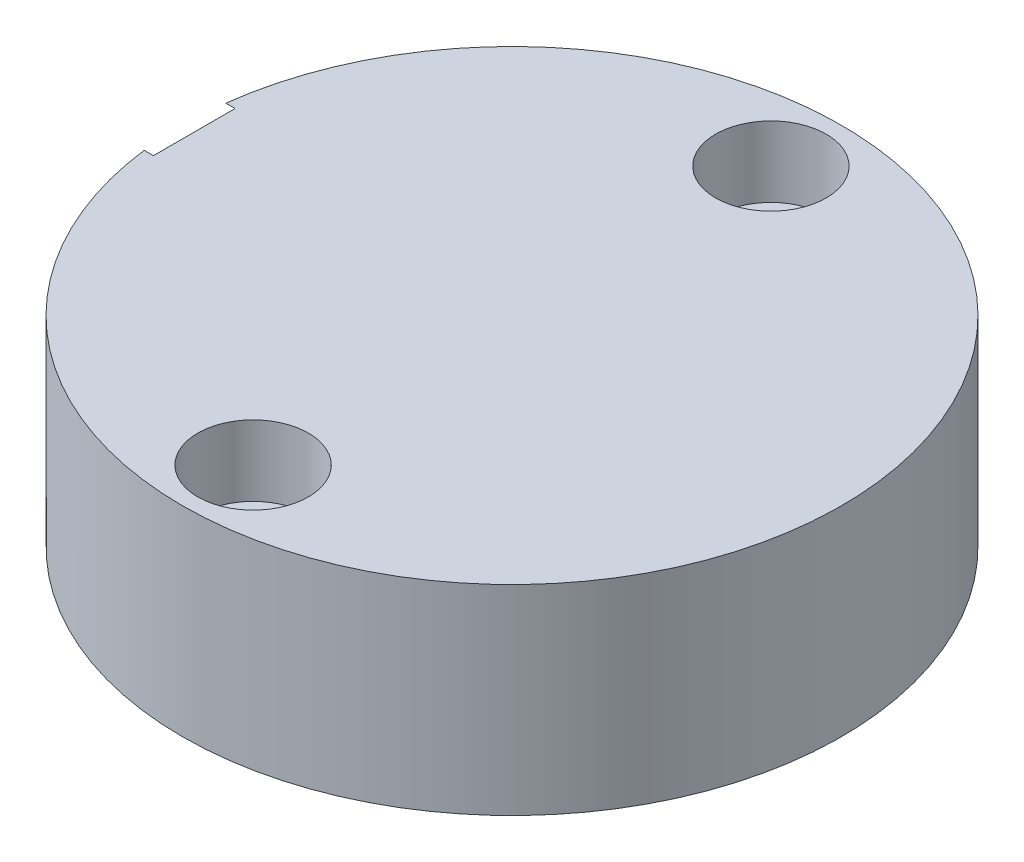
ISO-10303-21;
HEADER;
FILE_DESCRIPTION(('STEP AP214'),'2;1');
FILE_NAME('part.step','',(''),(''),'','','');
FILE_SCHEMA(('AUTOMOTIVE_DESIGN { 1 0 10303 214 1 1 1 1 }'));
ENDSEC;
DATA;
#1=APPLICATION_CONTEXT('core data for automotive mechanical design processes');
#2=APPLICATION_PROTOCOL_DEFINITION('international standard','automotive_design',2000,#1);
#3=PRODUCT_CONTEXT('',#1,'mechanical');
#4=PRODUCT('Part','Part','',(#3));
#5=PRODUCT_RELATED_PRODUCT_CATEGORY('part','',(#4));
#6=PRODUCT_DEFINITION_FORMATION('','',#4);
#7=PRODUCT_DEFINITION_CONTEXT('part definition',#1,'design');
#8=PRODUCT_DEFINITION('design','',#6,#7);
#9=PRODUCT_DEFINITION_SHAPE('','',#8);
#10=(LENGTH_UNIT() NAMED_UNIT(*) SI_UNIT(.MILLI.,.METRE.));
#11=(NAMED_UNIT(*) PLANE_ANGLE_UNIT() SI_UNIT($,.RADIAN.));
#12=(NAMED_UNIT(*) SI_UNIT($,.STERADIAN.) SOLID_ANGLE_UNIT());
#13=UNCERTAINTY_MEASURE_WITH_UNIT(LENGTH_MEASURE(1.E-05),#10,'distance_accuracy_value','');
#14=(GEOMETRIC_REPRESENTATION_CONTEXT(3) GLOBAL_UNCERTAINTY_ASSIGNED_CONTEXT((#13)) GLOBAL_UNIT_ASSIGNED_CONTEXT((#10,
#11,#12)) REPRESENTATION_CONTEXT('',''));
#15=CARTESIAN_POINT('',(0.,0.,0.));
#16=DIRECTION('',(0.,0.,1.));
#17=DIRECTION('',(1.,0.,0.));
#18=AXIS2_PLACEMENT_3D('',#15,#16,#17);
#19=CARTESIAN_POINT('',(0.,0.,0.));
#20=DIRECTION('',(0.,1.,0.));
#21=DIRECTION('',(0.,0.,1.));
#22=AXIS2_PLACEMENT_3D('',#19,#20,#21);
#23=CYLINDRICAL_SURFACE('',#22,14.224);
#24=CARTESIAN_POINT('',(-14.1144017031364,8.636,-1.76233951396999));
#25=CARTESIAN_POINT('',(-14.1018189708603,8.5860400774121,-1.86316944306617));
#26=CARTESIAN_POINT('',(-14.0884029510449,8.53182037336474,-1.96177374774942));
#27=CARTESIAN_POINT('',(-14.060309209815,8.41531440898184,-2.15389238319063));
#28=CARTESIAN_POINT('',(-14.0456316331366,8.35302907358731,-2.24740729584016));
#29=CARTESIAN_POINT('',(-14.0153964032384,8.22074490813978,-2.42885291939024));
#30=CARTESIAN_POINT('',(-13.9998376006231,8.15073588572585,-2.51677600419321));
#31=CARTESIAN_POINT('',(-13.9682944020645,8.00356223569752,-2.68632848078117));
#32=CARTESIAN_POINT('',(-13.9523100128641,7.92639772140656,-2.76795797220202));
#33=CARTESIAN_POINT('',(-13.9203573702186,7.76540029526525,-2.92441560607991));
#34=CARTESIAN_POINT('',(-13.9043891243674,7.68156506176776,-2.99924136100932));
#35=CARTESIAN_POINT('',(-13.8729273525824,7.50779999847033,-3.1415560905345));
#36=CARTESIAN_POINT('',(-13.8574338186305,7.41787027169462,-3.20904518910241));
#37=CARTESIAN_POINT('',(-13.8273998231862,7.23269940985755,-3.33608202397885));
#38=CARTESIAN_POINT('',(-13.8128574379487,7.1374697652673,-3.39564605863353));
#39=CARTESIAN_POINT('',(-13.7851236400461,6.94219371995553,-3.50653797394215));
#40=CARTESIAN_POINT('',(-13.7719315387029,6.84214981329113,-3.55787006074027));
#41=CARTESIAN_POINT('',(-13.7515217306795,6.67297933704027,-3.63577308768279));
#42=CARTESIAN_POINT('',(-13.7438077843705,6.60502971023918,-3.66479473624717));
#43=CARTESIAN_POINT('',(-13.7292386448564,6.46761208866137,-3.71899995238225));
#44=CARTESIAN_POINT('',(-13.7223825366595,6.39814580613028,-3.74418761569942));
#45=CARTESIAN_POINT('',(-13.716,6.3279809944466,-3.7674288314446));
#46=B_SPLINE_CURVE_WITH_KNOTS('',3,(#24,#25,#26,#27,#28,#29,#30,#31,#32,#33,#34,#35,#36,#37,#38,
#39,#40,#41,#42,#43,#44,#45),.UNSPECIFIED.,.F.,.F.,(4,2,2,2,2,2,2,2,2,2,4),(0.,
0.339571560025639,0.679104213490783,1.01909040632158,1.35907121561906,1.6991708722571,
2.0392647811214,2.37864808472907,2.71785742283711,2.94061439026513,3.1631316964547),.UNSPECIFIED.);
#47=CARTESIAN_POINT('',(-14.1144017031364,8.636,-1.76233951396999));
#48=VERTEX_POINT('',#47);
#49=CARTESIAN_POINT('',(-13.716,6.3279809944466,-3.7674288314446));
#50=VERTEX_POINT('',#49);
#51=EDGE_CURVE('E183',#48,#50,#46,.T.);
#52=ORIENTED_EDGE('',*,*,#51,.F.);
#53=CARTESIAN_POINT('',(0.,8.636,0.));
#54=DIRECTION('',(0.,1.,0.));
#55=DIRECTION('',(0.,0.,1.));
#56=AXIS2_PLACEMENT_3D('',#53,#54,#55);
#57=CIRCLE('',#56,14.224);
#58=CARTESIAN_POINT('',(-14.1144017031364,8.636,1.76233951396999));
#59=VERTEX_POINT('',#58);
#60=EDGE_CURVE('E152',#59,#48,#57,.T.);
#61=ORIENTED_EDGE('',*,*,#60,.F.);
#62=CARTESIAN_POINT('',(-13.716,6.32798099444662,3.7674288314446));
#63=CARTESIAN_POINT('',(-13.7256752274223,6.43441671403951,3.73218226606413));
#64=CARTESIAN_POINT('',(-13.7364511952819,6.5392480193785,3.69244070180806));
#65=CARTESIAN_POINT('',(-13.7598334716294,6.74499152616562,3.60434170694817));
#66=CARTESIAN_POINT('',(-13.7724394284483,6.84590447589213,3.55598593133243));
#67=CARTESIAN_POINT('',(-13.7991212477723,7.04319198204466,3.45099243760769));
#68=CARTESIAN_POINT('',(-13.8131978464105,7.1395642302546,3.39435056614256));
#69=CARTESIAN_POINT('',(-13.8423953365519,7.32706281981836,3.27324792969377));
#70=CARTESIAN_POINT('',(-13.8575162318728,7.41818914199239,3.2087871361258));
#71=CARTESIAN_POINT('',(-13.9037966552396,7.68277980250731,3.00434946030897));
#72=CARTESIAN_POINT('',(-13.9359009480219,7.8476460188197,2.85321568473428));
#73=CARTESIAN_POINT('',(-13.9989711835599,8.14950079732574,2.525596782463));
#74=CARTESIAN_POINT('',(-14.0299392423452,8.28654358683355,2.34916213506834));
#75=CARTESIAN_POINT('',(-14.0685657406809,8.44971584425602,2.09807351538581));
#76=CARTESIAN_POINT('',(-14.0782051283558,8.489695649873,2.03245392920464));
#77=CARTESIAN_POINT('',(-14.0968231765953,8.56576823735887,1.89901959457042));
#78=CARTESIAN_POINT('',(-14.1058026527453,8.6018658437257,1.83120771016513));
#79=CARTESIAN_POINT('',(-14.1144017031364,8.636,1.76233951396999));
#80=B_SPLINE_CURVE_WITH_KNOTS('',3,(#62,#63,#64,#65,#66,#67,#68,#69,#70,#71,#72,#73,#74,#75,#76,
#77,#78,#79),.UNSPECIFIED.,.F.,.F.,(4,2,2,2,2,2,2,2,4),(0.,0.337481169142765,0.674897570182395,
1.01248368238958,1.35007102877738,2.02460201647477,2.69780546224259,2.93003018694968,
3.16196290219643),.UNSPECIFIED.);
#81=CARTESIAN_POINT('',(-13.716,6.32798099444662,3.7674288314446));
#82=VERTEX_POINT('',#81);
#83=EDGE_CURVE('E57',#82,#59,#80,.T.);
#84=ORIENTED_EDGE('',*,*,#83,.F.);
#85=DIRECTION('',(0.,1.,0.));
#86=VECTOR('',#85,1.);
#87=CARTESIAN_POINT('',(-13.716,0.,3.7674288314446));
#88=LINE('',#87,#86);
#89=CARTESIAN_POINT('',(-13.716,3.83201900555338,3.7674288314446));
#90=VERTEX_POINT('',#89);
#91=EDGE_CURVE('E164',#90,#82,#88,.T.);
#92=ORIENTED_EDGE('',*,*,#91,.F.);
#93=CARTESIAN_POINT('',(-13.716,3.8320190055534,-3.7674288314446));
#94=CARTESIAN_POINT('',(-13.7256832030554,3.72549547487357,-3.73215300898994));
#95=CARTESIAN_POINT('',(-13.7364689511062,3.62057917763459,-3.69237510692438));
#96=CARTESIAN_POINT('',(-13.7598730650016,3.41467658831599,-3.60419119044807));
#97=CARTESIAN_POINT('',(-13.7724910095912,3.3136893996123,-3.55578715876054));
#98=CARTESIAN_POINT('',(-13.7991770735619,3.11642010455883,-3.45076856800852));
#99=CARTESIAN_POINT('',(-13.8132435746677,3.0201329211109,-3.39416314307337));
#100=CARTESIAN_POINT('',(-13.8424190011879,2.83279443524339,-3.27314752117977));
#101=CARTESIAN_POINT('',(-13.8575279696299,2.74174334922734,-3.20873700198464));
#102=CARTESIAN_POINT('',(-13.9037657698442,2.4773975772599,-3.00448246486439));
#103=CARTESIAN_POINT('',(-13.9358393240575,2.31267237301909,-2.85348831252477));
#104=CARTESIAN_POINT('',(-13.9989028009506,2.01080298829319,-2.52599924707586));
#105=CARTESIAN_POINT('',(-14.0298926315931,1.87366114569923,-2.3495021745848));
#106=CARTESIAN_POINT('',(-14.0877428513713,1.62926520659395,-1.97337670408356));
#107=CARTESIAN_POINT('',(-14.1145538216584,1.52235814638346,-1.77351423734908));
#108=CARTESIAN_POINT('',(-14.1605904232901,1.34387846931438,-1.35776696177541));
#109=CARTESIAN_POINT('',(-14.1798170716613,1.27230111456323,-1.14188430579399));
#110=CARTESIAN_POINT('',(-14.208102650291,1.16829544419417,-0.706019846943991));
#111=CARTESIAN_POINT('',(-14.2174060804188,1.13492416082455,-0.486279224026567));
#112=CARTESIAN_POINT('',(-14.2256485600171,1.10531829732902,-0.0441420578764475));
#113=CARTESIAN_POINT('',(-14.2245897983837,1.10907587415198,0.178253914530367));
#114=CARTESIAN_POINT('',(-14.2124057676836,1.15295471256416,0.612960969777735));
#115=CARTESIAN_POINT('',(-14.2015564223421,1.19207929289632,0.82538155554918));
#116=CARTESIAN_POINT('',(-14.1713318873773,1.30397960109528,1.24051122348173));
#117=CARTESIAN_POINT('',(-14.1519563507052,1.37675669875519,1.44321990995869));
#118=CARTESIAN_POINT('',(-14.106443156029,1.55466493345507,1.83573826506913));
#119=CARTESIAN_POINT('',(-14.0802343895498,1.66013864329423,2.02538406035225));
#120=CARTESIAN_POINT('',(-14.0238597684823,1.90021661958655,2.38467213064943));
#121=CARTESIAN_POINT('',(-13.9936921490099,2.03483389593779,2.55430541951769));
#122=CARTESIAN_POINT('',(-13.9314568097912,2.33472831851489,2.87476374704252));
#123=CARTESIAN_POINT('',(-13.8993593677901,2.5008933223189,3.02475174150323));
#124=CARTESIAN_POINT('',(-13.8378375095089,2.85626447377719,3.29479043090516));
#125=CARTESIAN_POINT('',(-13.8084099104598,3.04544253989866,3.41487707798468));
#126=CARTESIAN_POINT('',(-13.769424925045,3.33796885526584,3.56759035447409));
#127=CARTESIAN_POINT('',(-13.7575244888069,3.43446277740652,3.61311219815207));
#128=CARTESIAN_POINT('',(-13.7354216533658,3.63081755973086,3.69623910831399));
#129=CARTESIAN_POINT('',(-13.7252167492199,3.73067318611975,3.73385587576031));
#130=CARTESIAN_POINT('',(-13.716,3.83201900555338,3.7674288314446));
#131=B_SPLINE_CURVE_WITH_KNOTS('',3,(#93,#94,#95,#96,#97,#98,#99,#100,#101,#102,#103,#104,#105,
#106,#107,#108,#109,#110,#111,#112,#113,#114,#115,#116,#117,#118,#119,#120,#121,#122,#123,#124,
#125,#126,#127,#128,#129,#130),.UNSPECIFIED.,.F.,.F.,(4,2,2,2,2,2,2,2,2,2,2,2,2,2,2,2,2,2,4),
(0.,0.337759039795798,0.67544054528462,1.01274881551404,1.35007101640854,2.02390968472731,
2.69780544174397,3.37914838855052,4.06039993897245,4.7244481709033,5.3883561331668,
6.0341184903109,6.6799071349001,7.33270466319959,7.98579420813523,8.6611203768652,
9.33563059739257,9.65738621520687,9.97866216791095),.UNSPECIFIED.);
#132=CARTESIAN_POINT('',(-13.716,3.8320190055534,-3.7674288314446));
#133=VERTEX_POINT('',#132);
#134=EDGE_CURVE('E158',#133,#90,#131,.T.);
#135=ORIENTED_EDGE('',*,*,#134,.F.);
#136=DIRECTION('',(0.,1.,0.));
#137=VECTOR('',#136,1.);
#138=CARTESIAN_POINT('',(-13.716,0.,-3.7674288314446));
#139=LINE('',#138,#137);
#140=EDGE_CURVE('E184',#50,#133,#139,.F.);
#141=ORIENTED_EDGE('',*,*,#140,.F.);
#142=EDGE_LOOP('',(#52,#61,#84,#92,#135,#141));
#143=FACE_BOUND('',#142,.T.);
#144=CARTESIAN_POINT('',(0.,0.,0.));
#145=DIRECTION('',(0.,1.,0.));
#146=DIRECTION('',(0.,0.,1.));
#147=AXIS2_PLACEMENT_3D('',#144,#145,#146);
#148=CIRCLE('',#147,14.224);
#149=CARTESIAN_POINT('',(0.,0.,14.224));
#150=VERTEX_POINT('',#149);
#151=EDGE_CURVE('E155',#150,#150,#148,.T.);
#152=ORIENTED_EDGE('',*,*,#151,.T.);
#153=EDGE_LOOP('',(#152));
#154=FACE_BOUND('',#153,.T.);
#155=ADVANCED_FACE('F34',(#143,#154),#23,.T.);
#156=CARTESIAN_POINT('',(14.224,0.,0.));
#157=DIRECTION('',(0.,-1.,0.));
#158=DIRECTION('',(0.,0.,-1.));
#159=AXIS2_PLACEMENT_3D('',#156,#157,#158);
#160=PLANE('',#159);
#161=CARTESIAN_POINT('',(0.,0.,0.));
#162=DIRECTION('',(0.,-1.,0.));
#163=DIRECTION('',(0.,0.,-1.));
#164=AXIS2_PLACEMENT_3D('',#161,#162,#163);
#165=CIRCLE('',#164,7.74699999999999);
#166=CARTESIAN_POINT('',(0.,0.,-7.74699999999999));
#167=VERTEX_POINT('',#166);
#168=EDGE_CURVE('E98',#167,#167,#165,.T.);
#169=ORIENTED_EDGE('',*,*,#168,.F.);
#170=EDGE_LOOP('',(#169));
#171=FACE_BOUND('',#170,.T.);
#172=CARTESIAN_POINT('',(7.90262538654086,0.,-7.90262538654086));
#173=DIRECTION('',(0.,-1.,0.));
#174=DIRECTION('',(0.,0.,-1.));
#175=AXIS2_PLACEMENT_3D('',#172,#173,#174);
#176=CIRCLE('',#175,1.52399999999999);
#177=CARTESIAN_POINT('',(7.90262538654086,0.,-9.42662538654085));
#178=VERTEX_POINT('',#177);
#179=EDGE_CURVE('E104',#178,#178,#176,.T.);
#180=ORIENTED_EDGE('',*,*,#179,.F.);
#181=EDGE_LOOP('',(#180));
#182=FACE_BOUND('',#181,.T.);
#183=CARTESIAN_POINT('',(-7.90262538654086,0.,7.90262538654086));
#184=DIRECTION('',(0.,-1.,0.));
#185=DIRECTION('',(0.,0.,-1.));
#186=AXIS2_PLACEMENT_3D('',#183,#184,#185);
#187=CIRCLE('',#186,1.52399999999999);
#188=CARTESIAN_POINT('',(-7.90262538654086,0.,6.37862538654087));
#189=VERTEX_POINT('',#188);
#190=EDGE_CURVE('E110',#189,#189,#187,.T.);
#191=ORIENTED_EDGE('',*,*,#190,.F.);
#192=EDGE_LOOP('',(#191));
#193=FACE_BOUND('',#192,.T.);
#194=CARTESIAN_POINT('',(7.90262538654086,0.,7.90262538654086));
#195=DIRECTION('',(0.,-1.,0.));
#196=DIRECTION('',(0.,0.,-1.));
#197=AXIS2_PLACEMENT_3D('',#194,#195,#196);
#198=CIRCLE('',#197,1.52399999999999);
#199=CARTESIAN_POINT('',(7.90262538654086,0.,6.37862538654087));
#200=VERTEX_POINT('',#199);
#201=EDGE_CURVE('E116',#200,#200,#198,.T.);
#202=ORIENTED_EDGE('',*,*,#201,.F.);
#203=EDGE_LOOP('',(#202));
#204=FACE_BOUND('',#203,.T.);
#205=CARTESIAN_POINT('',(-7.90262538654086,0.,-7.90262538654086));
#206=DIRECTION('',(0.,-1.,0.));
#207=DIRECTION('',(0.,0.,-1.));
#208=AXIS2_PLACEMENT_3D('',#205,#206,#207);
#209=CIRCLE('',#208,1.52399999999999);
#210=CARTESIAN_POINT('',(-7.90262538654086,0.,-9.42662538654085));
#211=VERTEX_POINT('',#210);
#212=EDGE_CURVE('E122',#211,#211,#209,.T.);
#213=ORIENTED_EDGE('',*,*,#212,.F.);
#214=EDGE_LOOP('',(#213));
#215=FACE_BOUND('',#214,.T.);
#216=CARTESIAN_POINT('',(0.,0.,11.176));
#217=DIRECTION('',(0.,1.,0.));
#218=DIRECTION('',(0.,0.,1.));
#219=AXIS2_PLACEMENT_3D('',#216,#217,#218);
#220=CIRCLE('',#219,1.52400000000001);
#221=CARTESIAN_POINT('',(0.,0.,12.7));
#222=VERTEX_POINT('',#221);
#223=EDGE_CURVE('E137',#222,#222,#220,.T.);
#224=ORIENTED_EDGE('',*,*,#223,.T.);
#225=EDGE_LOOP('',(#224));
#226=FACE_BOUND('',#225,.T.);
#227=CARTESIAN_POINT('',(0.,0.,-11.176));
#228=DIRECTION('',(0.,1.,0.));
#229=DIRECTION('',(0.,0.,1.));
#230=AXIS2_PLACEMENT_3D('',#227,#228,#229);
#231=CIRCLE('',#230,1.52400000000001);
#232=CARTESIAN_POINT('',(0.,0.,-9.65199999999999));
#233=VERTEX_POINT('',#232);
#234=EDGE_CURVE('E149',#233,#233,#231,.T.);
#235=ORIENTED_EDGE('',*,*,#234,.T.);
#236=EDGE_LOOP('',(#235));
#237=FACE_BOUND('',#236,.T.);
#238=ORIENTED_EDGE('',*,*,#151,.F.);
#239=EDGE_LOOP('',(#238));
#240=FACE_BOUND('',#239,.T.);
#241=ADVANCED_FACE('F200',(#171,#182,#193,#204,#215,#226,#237,#240),#160,.T.);
#242=CARTESIAN_POINT('',(0.,8.636,0.));
#243=DIRECTION('',(0.,1.,0.));
#244=DIRECTION('',(0.,0.,1.));
#245=AXIS2_PLACEMENT_3D('',#242,#243,#244);
#246=PLANE('',#245);
#247=DIRECTION('',(-1.,0.,0.));
#248=VECTOR('',#247,1.);
#249=CARTESIAN_POINT('',(-14.224,8.636,-1.76233951396999));
#250=LINE('',#249,#248);
#251=CARTESIAN_POINT('',(-13.716,8.636,-1.76233951396999));
#252=VERTEX_POINT('',#251);
#253=EDGE_CURVE('E49',#252,#48,#250,.T.);
#254=ORIENTED_EDGE('',*,*,#253,.F.);
#255=DIRECTION('',(0.,0.,-1.));
#256=VECTOR('',#255,1.);
#257=CARTESIAN_POINT('',(-13.716,8.636,0.));
#258=LINE('',#257,#256);
#259=CARTESIAN_POINT('',(-13.716,8.636,1.76233951396999));
#260=VERTEX_POINT('',#259);
#261=EDGE_CURVE('E189',#260,#252,#258,.T.);
#262=ORIENTED_EDGE('',*,*,#261,.F.);
#263=DIRECTION('',(-1.,0.,0.));
#264=VECTOR('',#263,1.);
#265=CARTESIAN_POINT('',(-14.224,8.636,1.76233951396999));
#266=LINE('',#265,#264);
#267=EDGE_CURVE('E88',#59,#260,#266,.F.);
#268=ORIENTED_EDGE('',*,*,#267,.F.);
#269=ORIENTED_EDGE('',*,*,#60,.T.);
#270=EDGE_LOOP('',(#254,#262,#268,#269));
#271=FACE_BOUND('',#270,.T.);
#272=CARTESIAN_POINT('',(0.,8.636,11.176));
#273=DIRECTION('',(0.,1.,0.));
#274=DIRECTION('',(0.,0.,1.));
#275=AXIS2_PLACEMENT_3D('',#272,#273,#274);
#276=CIRCLE('',#275,2.38759999999999);
#277=CARTESIAN_POINT('',(0.,8.636,13.5636));
#278=VERTEX_POINT('',#277);
#279=EDGE_CURVE('E128',#278,#278,#276,.T.);
#280=ORIENTED_EDGE('',*,*,#279,.F.);
#281=EDGE_LOOP('',(#280));
#282=FACE_BOUND('',#281,.T.);
#283=CARTESIAN_POINT('',(0.,8.636,-11.176));
#284=DIRECTION('',(0.,1.,0.));
#285=DIRECTION('',(0.,0.,1.));
#286=AXIS2_PLACEMENT_3D('',#283,#284,#285);
#287=CIRCLE('',#286,2.38759999999999);
#288=CARTESIAN_POINT('',(0.,8.636,-8.78840000000001));
#289=VERTEX_POINT('',#288);
#290=EDGE_CURVE('E140',#289,#289,#287,.T.);
#291=ORIENTED_EDGE('',*,*,#290,.F.);
#292=EDGE_LOOP('',(#291));
#293=FACE_BOUND('',#292,.T.);
#294=ADVANCED_FACE('F205',(#271,#282,#293),#246,.T.);
#295=CARTESIAN_POINT('',(0.,8.636,-11.176));
#296=DIRECTION('',(0.,1.,0.));
#297=DIRECTION('',(0.,0.,1.));
#298=AXIS2_PLACEMENT_3D('',#295,#296,#297);
#299=CYLINDRICAL_SURFACE('',#298,1.52400000000001);
#300=ORIENTED_EDGE('',*,*,#234,.F.);
#301=EDGE_LOOP('',(#300));
#302=FACE_BOUND('',#301,.T.);
#303=CARTESIAN_POINT('',(0.,5.588,-11.176));
#304=DIRECTION('',(0.,1.,0.));
#305=DIRECTION('',(0.,0.,1.));
#306=AXIS2_PLACEMENT_3D('',#303,#304,#305);
#307=CIRCLE('',#306,1.52400000000001);
#308=CARTESIAN_POINT('',(0.,5.588,-9.65199999999999));
#309=VERTEX_POINT('',#308);
#310=EDGE_CURVE('E146',#309,#309,#307,.T.);
#311=ORIENTED_EDGE('',*,*,#310,.T.);
#312=EDGE_LOOP('',(#311));
#313=FACE_BOUND('',#312,.T.);
#314=ADVANCED_FACE('F289',(#302,#313),#299,.F.);
#315=CARTESIAN_POINT('',(1.52400000000001,5.588,-11.176));
#316=DIRECTION('',(0.,-1.,0.));
#317=DIRECTION('',(0.,0.,-1.));
#318=AXIS2_PLACEMENT_3D('',#315,#316,#317);
#319=PLANE('',#318);
#320=ORIENTED_EDGE('',*,*,#310,.F.);
#321=EDGE_LOOP('',(#320));
#322=FACE_BOUND('',#321,.T.);
#323=CARTESIAN_POINT('',(0.,5.588,-11.176));
#324=DIRECTION('',(0.,1.,0.));
#325=DIRECTION('',(0.,0.,1.));
#326=AXIS2_PLACEMENT_3D('',#323,#324,#325);
#327=CIRCLE('',#326,2.38759999999999);
#328=CARTESIAN_POINT('',(0.,5.588,-8.78840000000001));
#329=VERTEX_POINT('',#328);
#330=EDGE_CURVE('E143',#329,#329,#327,.T.);
#331=ORIENTED_EDGE('',*,*,#330,.T.);
#332=EDGE_LOOP('',(#331));
#333=FACE_BOUND('',#332,.T.);
#334=ADVANCED_FACE('F285',(#322,#333),#319,.F.);
#335=CARTESIAN_POINT('',(0.,8.636,-11.176));
#336=DIRECTION('',(0.,1.,0.));
#337=DIRECTION('',(0.,0.,1.));
#338=AXIS2_PLACEMENT_3D('',#335,#336,#337);
#339=CYLINDRICAL_SURFACE('',#338,2.38759999999999);
#340=ORIENTED_EDGE('',*,*,#330,.F.);
#341=EDGE_LOOP('',(#340));
#342=FACE_BOUND('',#341,.T.);
#343=ORIENTED_EDGE('',*,*,#290,.T.);
#344=EDGE_LOOP('',(#343));
#345=FACE_BOUND('',#344,.T.);
#346=ADVANCED_FACE('F281',(#342,#345),#339,.F.);
#347=CARTESIAN_POINT('',(0.,8.636,11.176));
#348=DIRECTION('',(0.,1.,0.));
#349=DIRECTION('',(0.,0.,1.));
#350=AXIS2_PLACEMENT_3D('',#347,#348,#349);
#351=CYLINDRICAL_SURFACE('',#350,1.52400000000001);
#352=ORIENTED_EDGE('',*,*,#223,.F.);
#353=EDGE_LOOP('',(#352));
#354=FACE_BOUND('',#353,.T.);
#355=CARTESIAN_POINT('',(0.,5.588,11.176));
#356=DIRECTION('',(0.,1.,0.));
#357=DIRECTION('',(0.,0.,1.));
#358=AXIS2_PLACEMENT_3D('',#355,#356,#357);
#359=CIRCLE('',#358,1.52400000000001);
#360=CARTESIAN_POINT('',(0.,5.588,12.7));
#361=VERTEX_POINT('',#360);
#362=EDGE_CURVE('E134',#361,#361,#359,.T.);
#363=ORIENTED_EDGE('',*,*,#362,.T.);
#364=EDGE_LOOP('',(#363));
#365=FACE_BOUND('',#364,.T.);
#366=ADVANCED_FACE('F277',(#354,#365),#351,.F.);
#367=CARTESIAN_POINT('',(1.52400000000001,5.588,11.176));
#368=DIRECTION('',(0.,-1.,0.));
#369=DIRECTION('',(0.,0.,-1.));
#370=AXIS2_PLACEMENT_3D('',#367,#368,#369);
#371=PLANE('',#370);
#372=ORIENTED_EDGE('',*,*,#362,.F.);
#373=EDGE_LOOP('',(#372));
#374=FACE_BOUND('',#373,.T.);
#375=CARTESIAN_POINT('',(0.,5.588,11.176));
#376=DIRECTION('',(0.,1.,0.));
#377=DIRECTION('',(0.,0.,1.));
#378=AXIS2_PLACEMENT_3D('',#375,#376,#377);
#379=CIRCLE('',#378,2.38759999999999);
#380=CARTESIAN_POINT('',(0.,5.588,13.5636));
#381=VERTEX_POINT('',#380);
#382=EDGE_CURVE('E131',#381,#381,#379,.T.);
#383=ORIENTED_EDGE('',*,*,#382,.T.);
#384=EDGE_LOOP('',(#383));
#385=FACE_BOUND('',#384,.T.);
#386=ADVANCED_FACE('F273',(#374,#385),#371,.F.);
#387=CARTESIAN_POINT('',(0.,8.636,11.176));
#388=DIRECTION('',(0.,1.,0.));
#389=DIRECTION('',(0.,0.,1.));
#390=AXIS2_PLACEMENT_3D('',#387,#388,#389);
#391=CYLINDRICAL_SURFACE('',#390,2.38759999999999);
#392=ORIENTED_EDGE('',*,*,#382,.F.);
#393=EDGE_LOOP('',(#392));
#394=FACE_BOUND('',#393,.T.);
#395=ORIENTED_EDGE('',*,*,#279,.T.);
#396=EDGE_LOOP('',(#395));
#397=FACE_BOUND('',#396,.T.);
#398=ADVANCED_FACE('F269',(#394,#397),#391,.F.);
#399=CARTESIAN_POINT('',(-7.90262538654086,2.54,-7.90262538654086));
#400=DIRECTION('',(0.,1.,0.));
#401=DIRECTION('',(0.,0.,1.));
#402=AXIS2_PLACEMENT_3D('',#399,#400,#401);
#403=PLANE('',#402);
#404=CARTESIAN_POINT('',(-7.90262538654086,2.54,-7.90262538654086));
#405=DIRECTION('',(0.,-1.,0.));
#406=DIRECTION('',(0.,0.,-1.));
#407=AXIS2_PLACEMENT_3D('',#404,#405,#406);
#408=CIRCLE('',#407,1.52399999999999);
#409=CARTESIAN_POINT('',(-7.90262538654086,2.54,-9.42662538654084));
#410=VERTEX_POINT('',#409);
#411=EDGE_CURVE('E125',#410,#410,#408,.T.);
#412=ORIENTED_EDGE('',*,*,#411,.T.);
#413=EDGE_LOOP('',(#412));
#414=FACE_BOUND('',#413,.T.);
#415=ADVANCED_FACE('F265',(#414),#403,.F.);
#416=CARTESIAN_POINT('',(-7.90262538654086,0.,-7.90262538654086));
#417=DIRECTION('',(0.,-1.,0.));
#418=DIRECTION('',(0.,0.,-1.));
#419=AXIS2_PLACEMENT_3D('',#416,#417,#418);
#420=CYLINDRICAL_SURFACE('',#419,1.52399999999999);
#421=ORIENTED_EDGE('',*,*,#411,.F.);
#422=EDGE_LOOP('',(#421));
#423=FACE_BOUND('',#422,.T.);
#424=ORIENTED_EDGE('',*,*,#212,.T.);
#425=EDGE_LOOP('',(#424));
#426=FACE_BOUND('',#425,.T.);
#427=ADVANCED_FACE('F261',(#423,#426),#420,.F.);
#428=CARTESIAN_POINT('',(7.90262538654086,2.54,7.90262538654086));
#429=DIRECTION('',(0.,1.,0.));
#430=DIRECTION('',(0.,0.,1.));
#431=AXIS2_PLACEMENT_3D('',#428,#429,#430);
#432=PLANE('',#431);
#433=CARTESIAN_POINT('',(7.90262538654086,2.54,7.90262538654086));
#434=DIRECTION('',(0.,-1.,0.));
#435=DIRECTION('',(0.,0.,-1.));
#436=AXIS2_PLACEMENT_3D('',#433,#434,#435);
#437=CIRCLE('',#436,1.52399999999999);
#438=CARTESIAN_POINT('',(7.90262538654086,2.54,6.37862538654087));
#439=VERTEX_POINT('',#438);
#440=EDGE_CURVE('E119',#439,#439,#437,.T.);
#441=ORIENTED_EDGE('',*,*,#440,.T.);
#442=EDGE_LOOP('',(#441));
#443=FACE_BOUND('',#442,.T.);
#444=ADVANCED_FACE('F257',(#443),#432,.F.);
#445=CARTESIAN_POINT('',(7.90262538654086,0.,7.90262538654086));
#446=DIRECTION('',(0.,-1.,0.));
#447=DIRECTION('',(0.,0.,-1.));
#448=AXIS2_PLACEMENT_3D('',#445,#446,#447);
#449=CYLINDRICAL_SURFACE('',#448,1.52399999999999);
#450=ORIENTED_EDGE('',*,*,#440,.F.);
#451=EDGE_LOOP('',(#450));
#452=FACE_BOUND('',#451,.T.);
#453=ORIENTED_EDGE('',*,*,#201,.T.);
#454=EDGE_LOOP('',(#453));
#455=FACE_BOUND('',#454,.T.);
#456=ADVANCED_FACE('F253',(#452,#455),#449,.F.);
#457=CARTESIAN_POINT('',(-7.90262538654086,2.54,7.90262538654086));
#458=DIRECTION('',(0.,1.,0.));
#459=DIRECTION('',(0.,0.,1.));
#460=AXIS2_PLACEMENT_3D('',#457,#458,#459);
#461=PLANE('',#460);
#462=CARTESIAN_POINT('',(-7.90262538654086,2.54,7.90262538654086));
#463=DIRECTION('',(0.,-1.,0.));
#464=DIRECTION('',(0.,0.,-1.));
#465=AXIS2_PLACEMENT_3D('',#462,#463,#464);
#466=CIRCLE('',#465,1.52399999999999);
#467=CARTESIAN_POINT('',(-7.90262538654086,2.54,6.37862538654087));
#468=VERTEX_POINT('',#467);
#469=EDGE_CURVE('E113',#468,#468,#466,.T.);
#470=ORIENTED_EDGE('',*,*,#469,.T.);
#471=EDGE_LOOP('',(#470));
#472=FACE_BOUND('',#471,.T.);
#473=ADVANCED_FACE('F249',(#472),#461,.F.);
#474=CARTESIAN_POINT('',(-7.90262538654086,0.,7.90262538654086));
#475=DIRECTION('',(0.,-1.,0.));
#476=DIRECTION('',(0.,0.,-1.));
#477=AXIS2_PLACEMENT_3D('',#474,#475,#476);
#478=CYLINDRICAL_SURFACE('',#477,1.52399999999999);
#479=ORIENTED_EDGE('',*,*,#469,.F.);
#480=EDGE_LOOP('',(#479));
#481=FACE_BOUND('',#480,.T.);
#482=ORIENTED_EDGE('',*,*,#190,.T.);
#483=EDGE_LOOP('',(#482));
#484=FACE_BOUND('',#483,.T.);
#485=ADVANCED_FACE('F245',(#481,#484),#478,.F.);
#486=CARTESIAN_POINT('',(7.90262538654086,2.54,-7.90262538654086));
#487=DIRECTION('',(0.,1.,0.));
#488=DIRECTION('',(0.,0.,1.));
#489=AXIS2_PLACEMENT_3D('',#486,#487,#488);
#490=PLANE('',#489);
#491=CARTESIAN_POINT('',(7.90262538654086,2.54,-7.90262538654086));
#492=DIRECTION('',(0.,-1.,0.));
#493=DIRECTION('',(0.,0.,-1.));
#494=AXIS2_PLACEMENT_3D('',#491,#492,#493);
#495=CIRCLE('',#494,1.52399999999999);
#496=CARTESIAN_POINT('',(7.90262538654086,2.54,-9.42662538654084));
#497=VERTEX_POINT('',#496);
#498=EDGE_CURVE('E107',#497,#497,#495,.T.);
#499=ORIENTED_EDGE('',*,*,#498,.T.);
#500=EDGE_LOOP('',(#499));
#501=FACE_BOUND('',#500,.T.);
#502=ADVANCED_FACE('F241',(#501),#490,.F.);
#503=CARTESIAN_POINT('',(7.90262538654086,0.,-7.90262538654086));
#504=DIRECTION('',(0.,-1.,0.));
#505=DIRECTION('',(0.,0.,-1.));
#506=AXIS2_PLACEMENT_3D('',#503,#504,#505);
#507=CYLINDRICAL_SURFACE('',#506,1.52399999999999);
#508=ORIENTED_EDGE('',*,*,#498,.F.);
#509=EDGE_LOOP('',(#508));
#510=FACE_BOUND('',#509,.T.);
#511=ORIENTED_EDGE('',*,*,#179,.T.);
#512=EDGE_LOOP('',(#511));
#513=FACE_BOUND('',#512,.T.);
#514=ADVANCED_FACE('F233',(#510,#513),#507,.F.);
#515=CARTESIAN_POINT('',(0.,2.53999999999999,0.));
#516=DIRECTION('',(0.,1.,0.));
#517=DIRECTION('',(0.,0.,1.));
#518=AXIS2_PLACEMENT_3D('',#515,#516,#517);
#519=PLANE('',#518);
#520=CARTESIAN_POINT('',(0.,2.54,0.));
#521=DIRECTION('',(0.,-1.,0.));
#522=DIRECTION('',(0.,0.,-1.));
#523=AXIS2_PLACEMENT_3D('',#520,#521,#522);
#524=CIRCLE('',#523,7.74699999999999);
#525=CARTESIAN_POINT('',(0.,2.54,-7.74699999999999));
#526=VERTEX_POINT('',#525);
#527=EDGE_CURVE('E101',#526,#526,#524,.T.);
#528=ORIENTED_EDGE('',*,*,#527,.T.);
#529=EDGE_LOOP('',(#528));
#530=FACE_BOUND('',#529,.T.);
#531=ADVANCED_FACE('F227',(#530),#519,.F.);
#532=CARTESIAN_POINT('',(0.,0.,0.));
#533=DIRECTION('',(0.,-1.,0.));
#534=DIRECTION('',(0.,0.,-1.));
#535=AXIS2_PLACEMENT_3D('',#532,#533,#534);
#536=CYLINDRICAL_SURFACE('',#535,7.74699999999999);
#537=ORIENTED_EDGE('',*,*,#527,.F.);
#538=EDGE_LOOP('',(#537));
#539=FACE_BOUND('',#538,.T.);
#540=ORIENTED_EDGE('',*,*,#168,.T.);
#541=EDGE_LOOP('',(#540));
#542=FACE_BOUND('',#541,.T.);
#543=ADVANCED_FACE('F222',(#539,#542),#536,.F.);
#544=CARTESIAN_POINT('',(-14.224,5.08,0.));
#545=DIRECTION('',(-1.,0.,0.));
#546=DIRECTION('',(0.,0.,1.));
#547=AXIS2_PLACEMENT_3D('',#544,#545,#546);
#548=CYLINDRICAL_SURFACE('',#547,3.96875);
#549=ORIENTED_EDGE('',*,*,#253,.T.);
#550=ORIENTED_EDGE('',*,*,#51,.T.);
#551=CARTESIAN_POINT('',(-13.716,5.08,0.));
#552=DIRECTION('',(-1.,0.,0.));
#553=DIRECTION('',(0.,0.,1.));
#554=AXIS2_PLACEMENT_3D('',#551,#552,#553);
#555=CIRCLE('',#554,3.96875);
#556=EDGE_CURVE('E93',#252,#50,#555,.T.);
#557=ORIENTED_EDGE('',*,*,#556,.F.);
#558=EDGE_LOOP('',(#549,#550,#557));
#559=FACE_BOUND('',#558,.T.);
#560=ADVANCED_FACE('F174',(#559),#548,.F.);
#561=ORIENTED_EDGE('',*,*,#267,.T.);
#562=EDGE_CURVE('E89',#82,#260,#555,.T.);
#563=ORIENTED_EDGE('',*,*,#562,.F.);
#564=ORIENTED_EDGE('',*,*,#83,.T.);
#565=EDGE_LOOP('',(#561,#563,#564));
#566=FACE_BOUND('',#565,.T.);
#567=ADVANCED_FACE('F82',(#566),#548,.F.);
#568=CARTESIAN_POINT('',(-7.11200000000001,5.08,0.));
#569=DIRECTION('',(-1.,0.,0.));
#570=DIRECTION('',(0.,0.,1.));
#571=AXIS2_PLACEMENT_3D('',#568,#569,#570);
#572=CONICAL_SURFACE('',#571,1.98374,1.04719755107321);
#573=CARTESIAN_POINT('',(-5.96668717667142,5.08,0.));
#574=VERTEX_POINT('',#573);
#575=VERTEX_LOOP('',#574);
#576=FACE_BOUND('',#575,.T.);
#577=CARTESIAN_POINT('',(-7.11200000000001,5.08,0.));
#578=DIRECTION('',(-1.,0.,0.));
#579=DIRECTION('',(0.,0.,1.));
#580=AXIS2_PLACEMENT_3D('',#577,#578,#579);
#581=CIRCLE('',#580,1.98374);
#582=CARTESIAN_POINT('',(-7.11200000000001,5.08,1.98374));
#583=VERTEX_POINT('',#582);
#584=EDGE_CURVE('E86',#583,#583,#581,.T.);
#585=ORIENTED_EDGE('',*,*,#584,.T.);
#586=EDGE_LOOP('',(#585));
#587=FACE_BOUND('',#586,.T.);
#588=ADVANCED_FACE('F78',(#576,#587),#572,.F.);
#589=CARTESIAN_POINT('',(-14.224,5.08,0.));
#590=DIRECTION('',(-1.,0.,0.));
#591=DIRECTION('',(0.,0.,1.));
#592=AXIS2_PLACEMENT_3D('',#589,#590,#591);
#593=CYLINDRICAL_SURFACE('',#592,1.98374);
#594=CARTESIAN_POINT('',(-13.2867400000242,5.08,0.));
#595=DIRECTION('',(1.,0.,0.));
#596=DIRECTION('',(0.,0.,-1.));
#597=AXIS2_PLACEMENT_3D('',#594,#595,#596);
#598=CIRCLE('',#597,1.98374);
#599=CARTESIAN_POINT('',(-13.2867400000242,5.08,-1.98374));
#600=VERTEX_POINT('',#599);
#601=EDGE_CURVE('E42',#600,#600,#598,.F.);
#602=ORIENTED_EDGE('',*,*,#601,.T.);
#603=EDGE_LOOP('',(#602));
#604=FACE_BOUND('',#603,.T.);
#605=ORIENTED_EDGE('',*,*,#584,.F.);
#606=EDGE_LOOP('',(#605));
#607=FACE_BOUND('',#606,.T.);
#608=ADVANCED_FACE('F81',(#604,#607),#593,.F.);
#609=CARTESIAN_POINT('',(-13.716,7.06374,0.));
#610=DIRECTION('',(1.,0.,0.));
#611=DIRECTION('',(0.,0.,-1.));
#612=AXIS2_PLACEMENT_3D('',#609,#610,#611);
#613=PLANE('',#612);
#614=CARTESIAN_POINT('',(-13.716,5.08,0.));
#615=DIRECTION('',(1.,0.,0.));
#616=DIRECTION('',(0.,0.,-1.));
#617=AXIS2_PLACEMENT_3D('',#614,#615,#616);
#618=CIRCLE('',#617,2.41299999997578);
#619=CARTESIAN_POINT('',(-13.716,5.08,-2.41299999997578));
#620=VERTEX_POINT('',#619);
#621=EDGE_CURVE('E11',#620,#620,#618,.T.);
#622=ORIENTED_EDGE('',*,*,#621,.T.);
#623=EDGE_LOOP('',(#622));
#624=FACE_BOUND('',#623,.T.);
#625=ORIENTED_EDGE('',*,*,#140,.T.);
#626=EDGE_CURVE('E95',#133,#90,#555,.T.);
#627=ORIENTED_EDGE('',*,*,#626,.T.);
#628=ORIENTED_EDGE('',*,*,#91,.T.);
#629=ORIENTED_EDGE('',*,*,#562,.T.);
#630=ORIENTED_EDGE('',*,*,#261,.T.);
#631=ORIENTED_EDGE('',*,*,#556,.T.);
#632=EDGE_LOOP('',(#625,#627,#628,#629,#630,#631));
#633=FACE_BOUND('',#632,.T.);
#634=ADVANCED_FACE('F172',(#624,#633),#613,.F.);
#635=ORIENTED_EDGE('',*,*,#626,.F.);
#636=ORIENTED_EDGE('',*,*,#134,.T.);
#637=EDGE_LOOP('',(#635,#636));
#638=FACE_BOUND('',#637,.T.);
#639=ADVANCED_FACE('F168',(#638),#548,.F.);
#640=CARTESIAN_POINT('',(-13.2867400000242,5.08,0.));
#641=DIRECTION('',(-1.,0.,0.));
#642=DIRECTION('',(0.,0.,1.));
#643=AXIS2_PLACEMENT_3D('',#640,#641,#642);
#644=CONICAL_SURFACE('',#643,1.98374,0.785398163397453);
#645=ORIENTED_EDGE('',*,*,#621,.F.);
#646=EDGE_LOOP('',(#645));
#647=FACE_BOUND('',#646,.T.);
#648=ORIENTED_EDGE('',*,*,#601,.F.);
#649=EDGE_LOOP('',(#648));
#650=FACE_BOUND('',#649,.T.);
#651=ADVANCED_FACE('F36',(#647,#650),#644,.F.);
#652=CLOSED_SHELL('',(#155,#241,#294,#314,#334,#346,#366,#386,#398,#415,#427,#444,#456,#473,
#485,#502,#514,#531,#543,#560,#567,#588,#608,#634,#639,#651));
#653=MANIFOLD_SOLID_BREP('B2',#652);
#654=ADVANCED_BREP_SHAPE_REPRESENTATION('',(#18,#653),#14);
#655=SHAPE_DEFINITION_REPRESENTATION(#9,#654);
ENDSEC;
END-ISO-10303-21;
